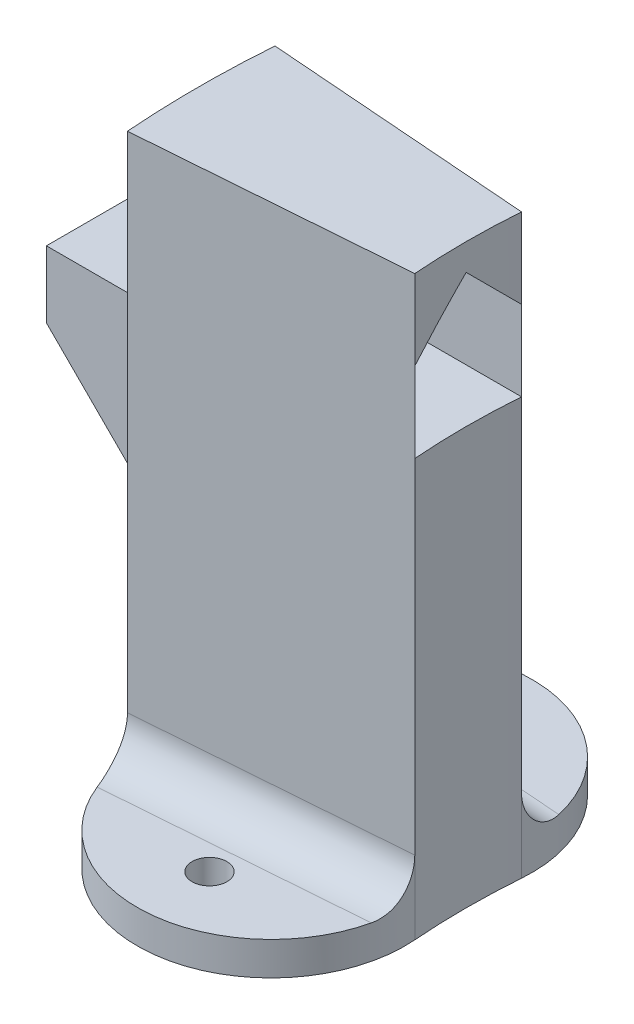
ISO-10303-21;
HEADER;
FILE_DESCRIPTION(('STEP AP214'),'2;1');
FILE_NAME('part.step','',(''),(''),'','','');
FILE_SCHEMA(('AUTOMOTIVE_DESIGN { 1 0 10303 214 1 1 1 1 }'));
ENDSEC;
DATA;
#1=APPLICATION_CONTEXT('core data for automotive mechanical design processes');
#2=APPLICATION_PROTOCOL_DEFINITION('international standard','automotive_design',2000,#1);
#3=PRODUCT_CONTEXT('',#1,'mechanical');
#4=PRODUCT('Part','Part','',(#3));
#5=PRODUCT_RELATED_PRODUCT_CATEGORY('part','',(#4));
#6=PRODUCT_DEFINITION_FORMATION('','',#4);
#7=PRODUCT_DEFINITION_CONTEXT('part definition',#1,'design');
#8=PRODUCT_DEFINITION('design','',#6,#7);
#9=PRODUCT_DEFINITION_SHAPE('','',#8);
#10=(LENGTH_UNIT() NAMED_UNIT(*) SI_UNIT(.MILLI.,.METRE.));
#11=(NAMED_UNIT(*) PLANE_ANGLE_UNIT() SI_UNIT($,.RADIAN.));
#12=(NAMED_UNIT(*) SI_UNIT($,.STERADIAN.) SOLID_ANGLE_UNIT());
#13=UNCERTAINTY_MEASURE_WITH_UNIT(LENGTH_MEASURE(1.E-05),#10,'distance_accuracy_value','');
#14=(GEOMETRIC_REPRESENTATION_CONTEXT(3) GLOBAL_UNCERTAINTY_ASSIGNED_CONTEXT((#13)) GLOBAL_UNIT_ASSIGNED_CONTEXT((#10,
#11,#12)) REPRESENTATION_CONTEXT('',''));
#15=CARTESIAN_POINT('',(0.,0.,0.));
#16=DIRECTION('',(0.,0.,1.));
#17=DIRECTION('',(1.,0.,0.));
#18=AXIS2_PLACEMENT_3D('',#15,#16,#17);
#19=CARTESIAN_POINT('',(0.,28.536162892,0.));
#20=DIRECTION('',(0.,1.,0.));
#21=DIRECTION('',(0.,0.,1.));
#22=AXIS2_PLACEMENT_3D('',#19,#20,#21);
#23=CYLINDRICAL_SURFACE('',#22,184.298091778145);
#24=DIRECTION('',(0.,1.,0.));
#25=VECTOR('',#24,1.);
#26=CARTESIAN_POINT('',(-184.017828030508,28.536162892,10.16));
#27=LINE('',#26,#25);
#28=CARTESIAN_POINT('',(-184.017828030508,47.5861628920004,10.16));
#29=VERTEX_POINT('',#28);
#30=CARTESIAN_POINT('',(-184.017828030508,79.336162892,10.16));
#31=VERTEX_POINT('',#30);
#32=EDGE_CURVE('E123',#29,#31,#27,.T.);
#33=ORIENTED_EDGE('',*,*,#32,.F.);
#34=CARTESIAN_POINT('',(0.,-136.43166513851,0.));
#35=DIRECTION('',(-0.707106781186551,-0.707106781186544,0.));
#36=DIRECTION('',(-0.707106781186544,0.707106781186551,0.));
#37=AXIS2_PLACEMENT_3D('',#34,#35,#36);
#38=ELLIPSE('',#37,260.636860912136,184.298091778145);
#39=CARTESIAN_POINT('',(-184.017828030508,47.5861628920005,-10.16));
#40=VERTEX_POINT('',#39);
#41=EDGE_CURVE('E64',#29,#40,#38,.T.);
#42=ORIENTED_EDGE('',*,*,#41,.T.);
#43=DIRECTION('',(0.,1.,0.));
#44=VECTOR('',#43,1.);
#45=CARTESIAN_POINT('',(-184.017828030508,28.536162892,-10.16));
#46=LINE('',#45,#44);
#47=CARTESIAN_POINT('',(-184.017828030508,79.336162892,-10.16));
#48=VERTEX_POINT('',#47);
#49=EDGE_CURVE('E93',#40,#48,#46,.T.);
#50=ORIENTED_EDGE('',*,*,#49,.T.);
#51=CARTESIAN_POINT('',(0.,79.336162892,0.));
#52=DIRECTION('',(0.,-1.,0.));
#53=DIRECTION('',(0.,0.,1.));
#54=AXIS2_PLACEMENT_3D('',#51,#52,#53);
#55=CIRCLE('',#54,184.298091778145);
#56=EDGE_CURVE('E96',#31,#48,#55,.T.);
#57=ORIENTED_EDGE('',*,*,#56,.F.);
#58=EDGE_LOOP('',(#33,#42,#50,#57));
#59=FACE_BOUND('',#58,.T.);
#60=ADVANCED_FACE('F55',(#59),#23,.F.);
#61=CARTESIAN_POINT('',(-184.017828030508,28.536162892,10.16));
#62=DIRECTION('',(0.,0.,1.));
#63=DIRECTION('',(1.,0.,0.));
#64=AXIS2_PLACEMENT_3D('',#61,#62,#63);
#65=PLANE('',#64);
#66=DIRECTION('',(0.,1.,0.));
#67=VECTOR('',#66,1.);
#68=CARTESIAN_POINT('',(-203.067828030508,28.536162892,10.16));
#69=LINE('',#68,#67);
#70=CARTESIAN_POINT('',(-203.067828030508,66.6361628920007,10.16));
#71=VERTEX_POINT('',#70);
#72=CARTESIAN_POINT('',(-203.067828030508,79.336162892,10.16));
#73=VERTEX_POINT('',#72);
#74=EDGE_CURVE('E126',#71,#73,#69,.T.);
#75=ORIENTED_EDGE('',*,*,#74,.F.);
#76=DIRECTION('',(0.707106781186544,-0.707106781186551,0.));
#77=VECTOR('',#76,1.);
#78=CARTESIAN_POINT('',(-174.492828030508,38.0611628920001,10.16));
#79=LINE('',#78,#77);
#80=EDGE_CURVE('E78',#71,#29,#79,.T.);
#81=ORIENTED_EDGE('',*,*,#80,.T.);
#82=ORIENTED_EDGE('',*,*,#32,.T.);
#83=DIRECTION('',(1.,0.,0.));
#84=VECTOR('',#83,1.);
#85=CARTESIAN_POINT('',(-184.017828030508,79.336162892,10.16));
#86=LINE('',#85,#84);
#87=EDGE_CURVE('E101',#73,#31,#86,.T.);
#88=ORIENTED_EDGE('',*,*,#87,.F.);
#89=EDGE_LOOP('',(#75,#81,#82,#88));
#90=FACE_BOUND('',#89,.T.);
#91=ADVANCED_FACE('F135',(#90),#65,.T.);
#92=CARTESIAN_POINT('',(-203.067828030508,28.536162892,-10.16));
#93=DIRECTION('',(-1.,0.,0.));
#94=DIRECTION('',(0.,0.,1.));
#95=AXIS2_PLACEMENT_3D('',#92,#93,#94);
#96=PLANE('',#95);
#97=DIRECTION('',(0.,1.,0.));
#98=VECTOR('',#97,1.);
#99=CARTESIAN_POINT('',(-203.067828030508,28.536162892,-10.16));
#100=LINE('',#99,#98);
#101=CARTESIAN_POINT('',(-203.067828030508,66.6361628920007,-10.16));
#102=VERTEX_POINT('',#101);
#103=CARTESIAN_POINT('',(-203.067828030508,79.336162892,-10.16));
#104=VERTEX_POINT('',#103);
#105=EDGE_CURVE('E100',#102,#104,#100,.T.);
#106=ORIENTED_EDGE('',*,*,#105,.F.);
#107=DIRECTION('',(0.,0.,1.));
#108=VECTOR('',#107,1.);
#109=CARTESIAN_POINT('',(-203.067828030508,66.6361628920007,10.16));
#110=LINE('',#109,#108);
#111=EDGE_CURVE('E125',#102,#71,#110,.T.);
#112=ORIENTED_EDGE('',*,*,#111,.T.);
#113=ORIENTED_EDGE('',*,*,#74,.T.);
#114=DIRECTION('',(0.,0.,1.));
#115=VECTOR('',#114,1.);
#116=CARTESIAN_POINT('',(-203.067828030508,79.336162892,-10.16));
#117=LINE('',#116,#115);
#118=EDGE_CURVE('E110',#104,#73,#117,.T.);
#119=ORIENTED_EDGE('',*,*,#118,.F.);
#120=EDGE_LOOP('',(#106,#112,#113,#119));
#121=FACE_BOUND('',#120,.T.);
#122=ADVANCED_FACE('F133',(#121),#96,.T.);
#123=CARTESIAN_POINT('',(-184.017828030508,28.536162892,-10.16));
#124=DIRECTION('',(0.,0.,-1.));
#125=DIRECTION('',(-1.,0.,0.));
#126=AXIS2_PLACEMENT_3D('',#123,#124,#125);
#127=PLANE('',#126);
#128=ORIENTED_EDGE('',*,*,#49,.F.);
#129=DIRECTION('',(-0.707106781186544,0.707106781186551,0.));
#130=VECTOR('',#129,1.);
#131=CARTESIAN_POINT('',(-174.492828030508,38.0611628920001,-10.16));
#132=LINE('',#131,#130);
#133=EDGE_CURVE('E12',#40,#102,#132,.T.);
#134=ORIENTED_EDGE('',*,*,#133,.T.);
#135=ORIENTED_EDGE('',*,*,#105,.T.);
#136=DIRECTION('',(-1.,0.,0.));
#137=VECTOR('',#136,1.);
#138=CARTESIAN_POINT('',(-184.017828030508,79.336162892,-10.16));
#139=LINE('',#138,#137);
#140=EDGE_CURVE('E104',#48,#104,#139,.T.);
#141=ORIENTED_EDGE('',*,*,#140,.F.);
#142=EDGE_LOOP('',(#128,#134,#135,#141));
#143=FACE_BOUND('',#142,.T.);
#144=ADVANCED_FACE('F105',(#143),#127,.T.);
#145=CARTESIAN_POINT('',(0.,79.336162892,0.));
#146=DIRECTION('',(0.,1.,0.));
#147=DIRECTION('',(0.,0.,1.));
#148=AXIS2_PLACEMENT_3D('',#145,#146,#147);
#149=PLANE('',#148);
#150=CARTESIAN_POINT('',(-192.907828030508,79.336162892,0.));
#151=DIRECTION('',(0.,1.,0.));
#152=DIRECTION('',(0.,0.,1.));
#153=AXIS2_PLACEMENT_3D('',#150,#151,#152);
#154=CIRCLE('',#153,2.99084999999999);
#155=CARTESIAN_POINT('',(-192.907828030508,79.336162892,2.99084999999999));
#156=VERTEX_POINT('',#155);
#157=EDGE_CURVE('E117',#156,#156,#154,.T.);
#158=ORIENTED_EDGE('',*,*,#157,.F.);
#159=EDGE_LOOP('',(#158));
#160=FACE_BOUND('',#159,.T.);
#161=ORIENTED_EDGE('',*,*,#56,.T.);
#162=ORIENTED_EDGE('',*,*,#140,.T.);
#163=ORIENTED_EDGE('',*,*,#118,.T.);
#164=ORIENTED_EDGE('',*,*,#87,.T.);
#165=EDGE_LOOP('',(#161,#162,#163,#164));
#166=FACE_BOUND('',#165,.T.);
#167=ADVANCED_FACE('F112',(#160,#166),#149,.T.);
#168=CARTESIAN_POINT('',(-203.067828030508,66.6361628920007,-10.16));
#169=DIRECTION('',(-0.707106781186551,-0.707106781186544,0.));
#170=DIRECTION('',(0.,0.,-1.));
#171=AXIS2_PLACEMENT_3D('',#168,#169,#170);
#172=PLANE('',#171);
#173=ORIENTED_EDGE('',*,*,#133,.F.);
#174=ORIENTED_EDGE('',*,*,#41,.F.);
#175=ORIENTED_EDGE('',*,*,#80,.F.);
#176=ORIENTED_EDGE('',*,*,#111,.F.);
#177=EDGE_LOOP('',(#173,#174,#175,#176));
#178=FACE_BOUND('',#177,.T.);
#179=ADVANCED_FACE('F58',(#178),#172,.T.);
#180=CARTESIAN_POINT('',(-192.907828030508,69.176162892,0.));
#181=DIRECTION('',(0.,1.,0.));
#182=DIRECTION('',(0.,0.,1.));
#183=AXIS2_PLACEMENT_3D('',#180,#181,#182);
#184=CYLINDRICAL_SURFACE('',#183,2.99084999999999);
#185=CARTESIAN_POINT('',(-192.907828030508,69.176162892,0.));
#186=DIRECTION('',(0.,1.,0.));
#187=DIRECTION('',(0.,0.,1.));
#188=AXIS2_PLACEMENT_3D('',#185,#186,#187);
#189=CIRCLE('',#188,2.99084999999999);
#190=CARTESIAN_POINT('',(-192.907828030508,69.176162892,2.99084999999999));
#191=VERTEX_POINT('',#190);
#192=EDGE_CURVE('E114',#191,#191,#189,.T.);
#193=ORIENTED_EDGE('',*,*,#192,.F.);
#194=EDGE_LOOP('',(#193));
#195=FACE_BOUND('',#194,.T.);
#196=ORIENTED_EDGE('',*,*,#157,.T.);
#197=EDGE_LOOP('',(#196));
#198=FACE_BOUND('',#197,.T.);
#199=ADVANCED_FACE('F137',(#195,#198),#184,.F.);
#200=CARTESIAN_POINT('',(-192.907828030508,69.176162892,0.));
#201=DIRECTION('',(0.,1.,0.));
#202=DIRECTION('',(0.,0.,1.));
#203=AXIS2_PLACEMENT_3D('',#200,#201,#202);
#204=PLANE('',#203);
#205=ORIENTED_EDGE('',*,*,#192,.T.);
#206=EDGE_LOOP('',(#205));
#207=FACE_BOUND('',#206,.T.);
#208=ADVANCED_FACE('F143',(#207),#204,.T.);
#209=CLOSED_SHELL('',(#60,#91,#122,#144,#167,#179,#199,#208));
#210=MANIFOLD_SOLID_BREP('B2',#209);
#211=CARTESIAN_POINT('',(0.,79.336162892,0.));
#212=DIRECTION('',(0.,1.,0.));
#213=DIRECTION('',(0.,0.,1.));
#214=AXIS2_PLACEMENT_3D('',#211,#212,#213);
#215=PLANE('',#214);
#216=CARTESIAN_POINT('',(0.,79.336162892,0.));
#217=DIRECTION('',(0.,1.,0.));
#218=DIRECTION('',(0.,0.,1.));
#219=AXIS2_PLACEMENT_3D('',#216,#217,#218);
#220=CIRCLE('',#219,133.35);
#221=CARTESIAN_POINT('',(-132.962389042917,79.336162892,-10.16));
#222=VERTEX_POINT('',#221);
#223=CARTESIAN_POINT('',(-132.962389042917,79.336162892,10.16));
#224=VERTEX_POINT('',#223);
#225=EDGE_CURVE('E384',#222,#224,#220,.T.);
#226=ORIENTED_EDGE('',*,*,#225,.F.);
#227=DIRECTION('',(1.,0.,0.));
#228=VECTOR('',#227,1.);
#229=CARTESIAN_POINT('',(-132.962389042917,79.336162892,-10.16));
#230=LINE('',#229,#228);
#231=CARTESIAN_POINT('',(-184.017828030508,79.336162892,-10.16));
#232=VERTEX_POINT('',#231);
#233=EDGE_CURVE('E336',#232,#222,#230,.T.);
#234=ORIENTED_EDGE('',*,*,#233,.F.);
#235=CARTESIAN_POINT('',(0.,79.336162892,0.));
#236=DIRECTION('',(0.,1.,0.));
#237=DIRECTION('',(0.,0.,1.));
#238=AXIS2_PLACEMENT_3D('',#235,#236,#237);
#239=CIRCLE('',#238,184.298091778145);
#240=CARTESIAN_POINT('',(-184.017828030508,79.336162892,10.16));
#241=VERTEX_POINT('',#240);
#242=EDGE_CURVE('E381',#232,#241,#239,.T.);
#243=ORIENTED_EDGE('',*,*,#242,.T.);
#244=DIRECTION('',(-1.,0.,0.));
#245=VECTOR('',#244,1.);
#246=CARTESIAN_POINT('',(-132.962389042917,79.336162892,10.16));
#247=LINE('',#246,#245);
#248=EDGE_CURVE('E339',#224,#241,#247,.T.);
#249=ORIENTED_EDGE('',*,*,#248,.F.);
#250=EDGE_LOOP('',(#226,#234,#243,#249));
#251=FACE_BOUND('',#250,.T.);
#252=ADVANCED_FACE('F212',(#251),#215,.T.);
#253=CARTESIAN_POINT('',(0.,79.336162892,0.));
#254=DIRECTION('',(0.0761904761904762,0.,-0.997093281161732));
#255=DIRECTION('',(-0.997093281161732,0.,-0.0761904761904762));
#256=AXIS2_PLACEMENT_3D('',#253,#254,#255);
#257=PLANE('',#256);
#258=DIRECTION('',(0.,-1.,0.));
#259=VECTOR('',#258,1.);
#260=CARTESIAN_POINT('',(-132.962389042917,79.336162892,-10.16));
#261=LINE('',#260,#259);
#262=CARTESIAN_POINT('',(-132.962389042917,13.97,-10.16));
#263=VERTEX_POINT('',#262);
#264=EDGE_CURVE('E388',#222,#263,#261,.T.);
#265=ORIENTED_EDGE('',*,*,#264,.T.);
#266=DIRECTION('',(0.997093281161732,0.,0.0761904761904762));
#267=VECTOR('',#266,1.);
#268=CARTESIAN_POINT('',(-183.762389042917,13.97,-14.041759373573));
#269=LINE('',#268,#267);
#270=CARTESIAN_POINT('',(-183.762389042917,13.97,-14.041759373573));
#271=VERTEX_POINT('',#270);
#272=EDGE_CURVE('E402',#263,#271,#269,.F.);
#273=ORIENTED_EDGE('',*,*,#272,.T.);
#274=DIRECTION('',(0.,-1.,0.));
#275=VECTOR('',#274,1.);
#276=CARTESIAN_POINT('',(-183.762389042917,79.336162892,-14.041759373573));
#277=LINE('',#276,#275);
#278=CARTESIAN_POINT('',(-183.762389042917,109.816162892,-14.041759373573));
#279=VERTEX_POINT('',#278);
#280=EDGE_CURVE('E307',#279,#271,#277,.T.);
#281=ORIENTED_EDGE('',*,*,#280,.F.);
#282=DIRECTION('',(-0.997093281161732,0.,-0.0761904761904762));
#283=VECTOR('',#282,1.);
#284=CARTESIAN_POINT('',(-132.962389042917,109.816162892,-10.16));
#285=LINE('',#284,#283);
#286=CARTESIAN_POINT('',(-132.962389042917,109.816162892,-10.16));
#287=VERTEX_POINT('',#286);
#288=EDGE_CURVE('E301',#287,#279,#285,.T.);
#289=ORIENTED_EDGE('',*,*,#288,.F.);
#290=DIRECTION('',(0.,-1.,0.));
#291=VECTOR('',#290,1.);
#292=CARTESIAN_POINT('',(-132.962389042917,109.816162892,-10.16));
#293=LINE('',#292,#291);
#294=CARTESIAN_POINT('',(-132.962389042917,94.576162892,-10.16));
#295=VERTEX_POINT('',#294);
#296=EDGE_CURVE('E230',#287,#295,#293,.T.);
#297=ORIENTED_EDGE('',*,*,#296,.T.);
#298=DIRECTION('',(0.,-1.,0.));
#299=VECTOR('',#298,1.);
#300=CARTESIAN_POINT('',(-132.962389042917,107.276162892,-10.16));
#301=LINE('',#300,#299);
#302=EDGE_CURVE('E330',#295,#222,#301,.T.);
#303=ORIENTED_EDGE('',*,*,#302,.T.);
#304=EDGE_LOOP('',(#265,#273,#281,#289,#297,#303));
#305=FACE_BOUND('',#304,.T.);
#306=ADVANCED_FACE('F304',(#305),#257,.T.);
#307=CARTESIAN_POINT('',(0.,79.336162892,0.));
#308=DIRECTION('',(0.,-1.,0.));
#309=DIRECTION('',(0.,0.,-1.));
#310=AXIS2_PLACEMENT_3D('',#307,#308,#309);
#311=CYLINDRICAL_SURFACE('',#310,184.298091778145);
#312=DIRECTION('',(0.,-1.,0.));
#313=VECTOR('',#312,1.);
#314=CARTESIAN_POINT('',(-183.762389042917,79.336162892,14.041759373573));
#315=LINE('',#314,#313);
#316=CARTESIAN_POINT('',(-183.762389042917,109.816162892,14.0417593735729));
#317=VERTEX_POINT('',#316);
#318=CARTESIAN_POINT('',(-183.762389042917,13.97,14.041759373573));
#319=VERTEX_POINT('',#318);
#320=EDGE_CURVE('E395',#317,#319,#315,.T.);
#321=ORIENTED_EDGE('',*,*,#320,.F.);
#322=CARTESIAN_POINT('',(0.,109.816162892,0.));
#323=DIRECTION('',(0.,1.,0.));
#324=DIRECTION('',(0.,0.,1.));
#325=AXIS2_PLACEMENT_3D('',#322,#323,#324);
#326=CIRCLE('',#325,184.298091778145);
#327=EDGE_CURVE('E311',#279,#317,#326,.T.);
#328=ORIENTED_EDGE('',*,*,#327,.F.);
#329=ORIENTED_EDGE('',*,*,#280,.T.);
#330=DIRECTION('',(0.,-1.,0.));
#331=VECTOR('',#330,1.);
#332=CARTESIAN_POINT('',(-183.762389042917,6.35,-14.041759373573));
#333=LINE('',#332,#331);
#334=CARTESIAN_POINT('',(-183.762389042917,0.,-14.041759373573));
#335=VERTEX_POINT('',#334);
#336=EDGE_CURVE('E354',#271,#335,#333,.T.);
#337=ORIENTED_EDGE('',*,*,#336,.T.);
#338=CARTESIAN_POINT('',(0.,0.,0.));
#339=DIRECTION('',(0.,1.,0.));
#340=DIRECTION('',(0.,0.,1.));
#341=AXIS2_PLACEMENT_3D('',#338,#339,#340);
#342=CIRCLE('',#341,184.298091778145);
#343=CARTESIAN_POINT('',(-183.762389042917,0.,14.041759373573));
#344=VERTEX_POINT('',#343);
#345=EDGE_CURVE('E380',#335,#344,#342,.T.);
#346=ORIENTED_EDGE('',*,*,#345,.T.);
#347=DIRECTION('',(0.,-1.,0.));
#348=VECTOR('',#347,1.);
#349=CARTESIAN_POINT('',(-183.762389042917,6.35,14.041759373573));
#350=LINE('',#349,#348);
#351=EDGE_CURVE('E377',#319,#344,#350,.T.);
#352=ORIENTED_EDGE('',*,*,#351,.F.);
#353=EDGE_LOOP('',(#321,#328,#329,#337,#346,#352));
#354=FACE_BOUND('',#353,.T.);
#355=CARTESIAN_POINT('',(0.,104.736162892,0.));
#356=DIRECTION('',(0.,-0.707106781186551,0.707106781186544));
#357=DIRECTION('',(0.,-0.707106781186544,-0.707106781186551));
#358=AXIS2_PLACEMENT_3D('',#355,#356,#357);
#359=ELLIPSE('',#358,260.636860912133,184.298091778145);
#360=CARTESIAN_POINT('',(-184.017828030508,94.576162892,-10.16));
#361=VERTEX_POINT('',#360);
#362=CARTESIAN_POINT('',(-184.298091778145,104.736162892,0.));
#363=VERTEX_POINT('',#362);
#364=EDGE_CURVE('E495',#361,#363,#359,.F.);
#365=ORIENTED_EDGE('',*,*,#364,.T.);
#366=CARTESIAN_POINT('',(0.,104.736162892,0.));
#367=DIRECTION('',(0.,-0.707106781186551,-0.707106781186544));
#368=DIRECTION('',(0.,-0.707106781186544,0.707106781186551));
#369=AXIS2_PLACEMENT_3D('',#366,#367,#368);
#370=ELLIPSE('',#369,260.636860912133,184.298091778145);
#371=CARTESIAN_POINT('',(-184.017828030508,94.5761628920001,10.16));
#372=VERTEX_POINT('',#371);
#373=EDGE_CURVE('E223',#363,#372,#370,.F.);
#374=ORIENTED_EDGE('',*,*,#373,.T.);
#375=DIRECTION('',(0.,-1.,0.));
#376=VECTOR('',#375,1.);
#377=CARTESIAN_POINT('',(-184.017828030508,107.276162892,10.16));
#378=LINE('',#377,#376);
#379=EDGE_CURVE('E342',#372,#241,#378,.T.);
#380=ORIENTED_EDGE('',*,*,#379,.T.);
#381=ORIENTED_EDGE('',*,*,#242,.F.);
#382=DIRECTION('',(0.,-1.,0.));
#383=VECTOR('',#382,1.);
#384=CARTESIAN_POINT('',(-184.017828030508,107.276162892,-10.16));
#385=LINE('',#384,#383);
#386=EDGE_CURVE('E327',#361,#232,#385,.T.);
#387=ORIENTED_EDGE('',*,*,#386,.F.);
#388=EDGE_LOOP('',(#365,#374,#380,#381,#387));
#389=FACE_BOUND('',#388,.T.);
#390=ADVANCED_FACE('F486',(#354,#389),#311,.T.);
#391=CARTESIAN_POINT('',(0.,79.336162892,0.));
#392=DIRECTION('',(-0.0761904761904762,0.,-0.997093281161732));
#393=DIRECTION('',(-0.997093281161732,0.,0.0761904761904762));
#394=AXIS2_PLACEMENT_3D('',#391,#392,#393);
#395=PLANE('',#394);
#396=ORIENTED_EDGE('',*,*,#320,.T.);
#397=DIRECTION('',(0.997093281161732,0.,-0.0761904761904762));
#398=VECTOR('',#397,1.);
#399=CARTESIAN_POINT('',(0.,13.97,0.));
#400=LINE('',#399,#398);
#401=CARTESIAN_POINT('',(-132.962389042917,13.97,10.16));
#402=VERTEX_POINT('',#401);
#403=EDGE_CURVE('E404',#319,#402,#400,.T.);
#404=ORIENTED_EDGE('',*,*,#403,.T.);
#405=DIRECTION('',(0.,-1.,0.));
#406=VECTOR('',#405,1.);
#407=CARTESIAN_POINT('',(-132.962389042917,79.336162892,10.16));
#408=LINE('',#407,#406);
#409=EDGE_CURVE('E392',#224,#402,#408,.T.);
#410=ORIENTED_EDGE('',*,*,#409,.F.);
#411=DIRECTION('',(0.,-1.,0.));
#412=VECTOR('',#411,1.);
#413=CARTESIAN_POINT('',(-132.962389042917,107.276162892,10.16));
#414=LINE('',#413,#412);
#415=CARTESIAN_POINT('',(-132.962389042917,94.5761628920001,10.16));
#416=VERTEX_POINT('',#415);
#417=EDGE_CURVE('E344',#416,#224,#414,.T.);
#418=ORIENTED_EDGE('',*,*,#417,.F.);
#419=DIRECTION('',(0.,-1.,0.));
#420=VECTOR('',#419,1.);
#421=CARTESIAN_POINT('',(-132.962389042917,109.816162892,10.16));
#422=LINE('',#421,#420);
#423=CARTESIAN_POINT('',(-132.962389042917,109.816162892,10.16));
#424=VERTEX_POINT('',#423);
#425=EDGE_CURVE('E328',#424,#416,#422,.T.);
#426=ORIENTED_EDGE('',*,*,#425,.F.);
#427=DIRECTION('',(0.997093281161732,0.,-0.0761904761904762));
#428=VECTOR('',#427,1.);
#429=CARTESIAN_POINT('',(-183.762389042917,109.816162892,14.041759373573));
#430=LINE('',#429,#428);
#431=EDGE_CURVE('E317',#317,#424,#430,.T.);
#432=ORIENTED_EDGE('',*,*,#431,.F.);
#433=EDGE_LOOP('',(#396,#404,#410,#418,#426,#432));
#434=FACE_BOUND('',#433,.T.);
#435=ADVANCED_FACE('F483',(#434),#395,.F.);
#436=CARTESIAN_POINT('',(0.,79.336162892,0.));
#437=DIRECTION('',(0.,-1.,0.));
#438=DIRECTION('',(0.,0.,-1.));
#439=AXIS2_PLACEMENT_3D('',#436,#437,#438);
#440=CYLINDRICAL_SURFACE('',#439,133.35);
#441=CARTESIAN_POINT('',(0.,0.,0.));
#442=DIRECTION('',(0.,1.,0.));
#443=DIRECTION('',(0.,0.,1.));
#444=AXIS2_PLACEMENT_3D('',#441,#442,#443);
#445=CIRCLE('',#444,133.35);
#446=CARTESIAN_POINT('',(-132.962389042917,0.,-10.16));
#447=VERTEX_POINT('',#446);
#448=CARTESIAN_POINT('',(-132.962389042917,0.,10.16));
#449=VERTEX_POINT('',#448);
#450=EDGE_CURVE('E385',#447,#449,#445,.T.);
#451=ORIENTED_EDGE('',*,*,#450,.F.);
#452=DIRECTION('',(0.,-1.,0.));
#453=VECTOR('',#452,1.);
#454=CARTESIAN_POINT('',(-132.962389042917,6.35,-10.16));
#455=LINE('',#454,#453);
#456=EDGE_CURVE('E360',#263,#447,#455,.T.);
#457=ORIENTED_EDGE('',*,*,#456,.F.);
#458=ORIENTED_EDGE('',*,*,#264,.F.);
#459=ORIENTED_EDGE('',*,*,#225,.T.);
#460=ORIENTED_EDGE('',*,*,#409,.T.);
#461=DIRECTION('',(0.,-1.,0.));
#462=VECTOR('',#461,1.);
#463=CARTESIAN_POINT('',(-132.962389042917,6.35,10.16));
#464=LINE('',#463,#462);
#465=EDGE_CURVE('E370',#402,#449,#464,.T.);
#466=ORIENTED_EDGE('',*,*,#465,.T.);
#467=EDGE_LOOP('',(#451,#457,#458,#459,#460,#466));
#468=FACE_BOUND('',#467,.T.);
#469=ADVANCED_FACE('F479',(#468),#440,.F.);
#470=CARTESIAN_POINT('',(0.,0.,0.));
#471=DIRECTION('',(0.,1.,0.));
#472=DIRECTION('',(0.,0.,1.));
#473=AXIS2_PLACEMENT_3D('',#470,#471,#472);
#474=PLANE('',#473);
#475=ORIENTED_EDGE('',*,*,#345,.F.);
#476=CARTESIAN_POINT('',(-158.362389042917,0.,-12.1008796867865));
#477=DIRECTION('',(0.,1.,0.));
#478=DIRECTION('',(0.,0.,1.));
#479=AXIS2_PLACEMENT_3D('',#476,#477,#478);
#480=CIRCLE('',#479,25.4740458890727);
#481=EDGE_CURVE('E351',#447,#335,#480,.T.);
#482=ORIENTED_EDGE('',*,*,#481,.F.);
#483=ORIENTED_EDGE('',*,*,#450,.T.);
#484=CARTESIAN_POINT('',(-158.362389042917,0.,12.1008796867865));
#485=DIRECTION('',(0.,1.,0.));
#486=DIRECTION('',(0.,0.,1.));
#487=AXIS2_PLACEMENT_3D('',#484,#485,#486);
#488=CIRCLE('',#487,25.4740458890727);
#489=EDGE_CURVE('E367',#344,#449,#488,.T.);
#490=ORIENTED_EDGE('',*,*,#489,.F.);
#491=EDGE_LOOP('',(#475,#482,#483,#490));
#492=FACE_BOUND('',#491,.T.);
#493=CARTESIAN_POINT('',(-157.391949199524,0.,24.8008796867865));
#494=DIRECTION('',(0.,1.,0.));
#495=DIRECTION('',(0.,0.,1.));
#496=AXIS2_PLACEMENT_3D('',#493,#494,#495);
#497=CIRCLE('',#496,3.32499999999999);
#498=CARTESIAN_POINT('',(-157.391949199524,0.,28.1258796867865));
#499=VERTEX_POINT('',#498);
#500=EDGE_CURVE('E362',#499,#499,#497,.T.);
#501=ORIENTED_EDGE('',*,*,#500,.T.);
#502=EDGE_LOOP('',(#501));
#503=FACE_BOUND('',#502,.T.);
#504=CARTESIAN_POINT('',(-157.391949199524,0.,-24.8008796867865));
#505=DIRECTION('',(0.,1.,0.));
#506=DIRECTION('',(0.,0.,1.));
#507=AXIS2_PLACEMENT_3D('',#504,#505,#506);
#508=CIRCLE('',#507,3.32499999999999);
#509=CARTESIAN_POINT('',(-157.391949199524,0.,-21.4758796867865));
#510=VERTEX_POINT('',#509);
#511=EDGE_CURVE('E346',#510,#510,#508,.T.);
#512=ORIENTED_EDGE('',*,*,#511,.T.);
#513=EDGE_LOOP('',(#512));
#514=FACE_BOUND('',#513,.T.);
#515=ADVANCED_FACE('F472',(#492,#503,#514),#474,.F.);
#516=CARTESIAN_POINT('',(-157.391949199524,6.35,24.8008796867865));
#517=DIRECTION('',(0.,-1.,0.));
#518=DIRECTION('',(0.,0.,-1.));
#519=AXIS2_PLACEMENT_3D('',#516,#517,#518);
#520=CYLINDRICAL_SURFACE('',#519,3.32499999999999);
#521=CARTESIAN_POINT('',(-157.391949199524,6.35,24.8008796867865));
#522=DIRECTION('',(0.,1.,0.));
#523=DIRECTION('',(0.,0.,1.));
#524=AXIS2_PLACEMENT_3D('',#521,#522,#523);
#525=CIRCLE('',#524,3.32499999999999);
#526=CARTESIAN_POINT('',(-157.391949199524,6.35,28.1258796867865));
#527=VERTEX_POINT('',#526);
#528=EDGE_CURVE('E363',#527,#527,#525,.T.);
#529=ORIENTED_EDGE('',*,*,#528,.T.);
#530=EDGE_LOOP('',(#529));
#531=FACE_BOUND('',#530,.T.);
#532=ORIENTED_EDGE('',*,*,#500,.F.);
#533=EDGE_LOOP('',(#532));
#534=FACE_BOUND('',#533,.T.);
#535=ADVANCED_FACE('F467',(#531,#534),#520,.F.);
#536=CARTESIAN_POINT('',(-158.362389042917,6.35,12.1008796867865));
#537=DIRECTION('',(0.,-1.,0.));
#538=DIRECTION('',(0.,0.,-1.));
#539=AXIS2_PLACEMENT_3D('',#536,#537,#538);
#540=CYLINDRICAL_SURFACE('',#539,25.4740458890727);
#541=ORIENTED_EDGE('',*,*,#489,.T.);
#542=ORIENTED_EDGE('',*,*,#465,.F.);
#543=CARTESIAN_POINT('',(-132.962389042917,13.97,10.16));
#544=CARTESIAN_POINT('',(-132.962411039116,13.7558693433996,10.159978649774));
#545=CARTESIAN_POINT('',(-132.961702059079,13.5417419702134,10.1689988250808));
#546=CARTESIAN_POINT('',(-132.958981105079,13.1150157717762,10.2049680908419));
#547=CARTESIAN_POINT('',(-132.956969188712,12.9024168793791,10.2319163887917));
#548=CARTESIAN_POINT('',(-132.951802841156,12.480376777311,10.3035663385194));
#549=CARTESIAN_POINT('',(-132.948649094578,12.2709337536777,10.3482573537765));
#550=CARTESIAN_POINT('',(-132.941506456313,11.8565637502954,10.4550895112339));
#551=CARTESIAN_POINT('',(-132.937517574879,11.6516367151359,10.5172304391976));
#552=CARTESIAN_POINT('',(-132.929107361247,11.2476452763914,10.6585887455456));
#553=CARTESIAN_POINT('',(-132.924685799965,11.0485840518347,10.7378151969143));
#554=CARTESIAN_POINT('',(-132.915913121206,10.6578560063875,10.9127941257492));
#555=CARTESIAN_POINT('',(-132.911562004874,10.4661893057644,11.0085468718668));
#556=CARTESIAN_POINT('',(-132.903508463486,10.0916588160135,11.2159097580957));
#557=CARTESIAN_POINT('',(-132.899805935687,9.90879363597232,11.3275173815555));
#558=CARTESIAN_POINT('',(-132.893684063928,9.55315567007875,11.5658270294909));
#559=CARTESIAN_POINT('',(-132.891264707682,9.38038278761045,11.6925289094303));
#560=CARTESIAN_POINT('',(-132.888386062382,9.04680350909757,11.9596315995628));
#561=CARTESIAN_POINT('',(-132.887919543076,8.88595514109972,12.099979905324));
#562=CARTESIAN_POINT('',(-132.889603355913,8.57668857125107,12.3937465344285));
#563=CARTESIAN_POINT('',(-132.891753646526,8.42827017217641,12.5471646503178));
#564=CARTESIAN_POINT('',(-132.899334336773,8.1449525056087,12.8659032626741));
#565=CARTESIAN_POINT('',(-132.904764288106,8.01005139336696,13.0312221297002));
#566=CARTESIAN_POINT('',(-132.919528555052,7.75470661922785,13.3725040683048));
#567=CARTESIAN_POINT('',(-132.928862769642,7.63426258336128,13.5484668643737));
#568=CARTESIAN_POINT('',(-132.951819042473,7.41037233494514,13.9068963185552));
#569=CARTESIAN_POINT('',(-132.965373601346,7.30669509423827,14.0892230288502));
#570=CARTESIAN_POINT('',(-132.997261257867,7.1147950913107,14.4614294082034));
#571=CARTESIAN_POINT('',(-133.015594297293,7.02657214081225,14.6513089852112));
#572=CARTESIAN_POINT('',(-133.057391922093,6.86604685083718,15.0371649378856));
#573=CARTESIAN_POINT('',(-133.080856987495,6.79374600191792,15.2331418824025));
#574=CARTESIAN_POINT('',(-133.133132258179,6.66539114541395,15.6295683661411));
#575=CARTESIAN_POINT('',(-133.161941530839,6.6093343074423,15.8300171196231));
#576=CARTESIAN_POINT('',(-133.240244155429,6.49052405876575,16.3312800284996));
#577=CARTESIAN_POINT('',(-133.293020054473,6.43752670398556,16.6339787599002));
#578=CARTESIAN_POINT('',(-133.380981768279,6.3848388200989,17.0888900660618));
#579=CARTESIAN_POINT('',(-133.411744888806,6.37174403219144,17.2405682105368));
#580=CARTESIAN_POINT('',(-133.476141261806,6.35432567781629,17.5438306292275));
#581=CARTESIAN_POINT('',(-133.509774701124,6.35000268280909,17.6954148966843));
#582=CARTESIAN_POINT('',(-133.544807419528,6.35,17.8467178610673));
#583=B_SPLINE_CURVE_WITH_KNOTS('',3,(#543,#544,#545,#546,#547,#548,#549,#550,#551,#552,#553,
#554,#555,#556,#557,#558,#559,#560,#561,#562,#563,#564,#565,#566,#567,#568,#569,#570,#571,#572,
#573,#574,#575,#576,#577,#578,#579,#580,#581,#582),.UNSPECIFIED.,.F.,.F.,(4,2,2,2,2,2,2,2,2,2,2,
2,2,2,2,2,2,2,2,4),(0.,0.642196266837894,1.28436414756263,1.92614763716852,2.56792324779492,
3.21004050564859,3.85216820274114,4.49419408828083,5.13621382654783,5.7758544143381,
6.4154848511548,7.05502787626522,7.69455435439479,8.32433659052735,8.95411115356481,
9.5839446482977,10.2136683335817,11.1463923071962,11.6121250454155,12.0778881239909),.UNSPECIFIED.);
#584=CARTESIAN_POINT('',(-133.544807419528,6.35,17.8467178610673));
#585=VERTEX_POINT('',#584);
#586=EDGE_CURVE('E445',#402,#585,#583,.T.);
#587=ORIENTED_EDGE('',*,*,#586,.T.);
#588=CARTESIAN_POINT('',(-158.362389042917,6.35,12.1008796867865));
#589=DIRECTION('',(0.,1.,0.));
#590=DIRECTION('',(0.,0.,1.));
#591=AXIS2_PLACEMENT_3D('',#588,#589,#590);
#592=CIRCLE('',#591,25.4740458890727);
#593=CARTESIAN_POINT('',(-182.018827809163,6.35,21.5507431174105));
#594=VERTEX_POINT('',#593);
#595=EDGE_CURVE('E366',#594,#585,#592,.T.);
#596=ORIENTED_EDGE('',*,*,#595,.F.);
#597=CARTESIAN_POINT('',(-182.018827809163,6.35,21.5507431174105));
#598=CARTESIAN_POINT('',(-182.098021632823,6.34997557158433,21.3525589117556));
#599=CARTESIAN_POINT('',(-182.174689239072,6.35816310395469,21.1533375693788));
#600=CARTESIAN_POINT('',(-182.322601205103,6.3911887295775,20.7542151684385));
#601=CARTESIAN_POINT('',(-182.393844332228,6.4160305948618,20.5543139661009));
#602=CARTESIAN_POINT('',(-182.530495207598,6.48258926335009,20.1553323547596));
#603=CARTESIAN_POINT('',(-182.59590338963,6.52430481083958,19.9562518857915));
#604=CARTESIAN_POINT('',(-182.720641674708,6.62462885268723,19.5604752561849));
#605=CARTESIAN_POINT('',(-182.77997238175,6.68323566613695,19.3637788603276));
#606=CARTESIAN_POINT('',(-182.892549635339,6.81732542147715,18.9739778272421));
#607=CARTESIAN_POINT('',(-182.945784236088,6.89284066948975,18.7808808426322));
#608=CARTESIAN_POINT('',(-183.046048888004,7.06034259370127,18.4002985370274));
#609=CARTESIAN_POINT('',(-183.093078921702,7.15232931627724,18.2128132318344));
#610=CARTESIAN_POINT('',(-183.181047232171,7.35218501130705,17.8451749634198));
#611=CARTESIAN_POINT('',(-183.221989315405,7.46004397505703,17.6650174701504));
#612=CARTESIAN_POINT('',(-183.298074782255,7.69098680906221,17.3134550774606));
#613=CARTESIAN_POINT('',(-183.333218320321,7.81407027364356,17.1420499449957));
#614=CARTESIAN_POINT('',(-183.39732527287,8.07162916433456,16.8132465525208));
#615=CARTESIAN_POINT('',(-183.426411605542,8.20577982748407,16.6556176603249));
#616=CARTESIAN_POINT('',(-183.4798088788,8.48693223440041,16.3513046673792));
#617=CARTESIAN_POINT('',(-183.504118294972,8.63393805896164,16.2046240696899));
#618=CARTESIAN_POINT('',(-183.548411916197,8.93977175499732,15.9233842202846));
#619=CARTESIAN_POINT('',(-183.568395328146,9.0986017870966,15.7888271938734));
#620=CARTESIAN_POINT('',(-183.604516770547,9.42695807907961,15.5328921839944));
#621=CARTESIAN_POINT('',(-183.620654738989,9.59648451139829,15.411514413073));
#622=CARTESIAN_POINT('',(-183.649706070083,9.94664476922201,15.1818116087317));
#623=CARTESIAN_POINT('',(-183.662588796642,10.1273655327008,15.0736152147763));
#624=CARTESIAN_POINT('',(-183.685418672021,10.4971741163368,14.8724198042725));
#625=CARTESIAN_POINT('',(-183.695366758562,10.6862592415336,14.7794159374323));
#626=CARTESIAN_POINT('',(-183.712780417014,11.0715252335438,14.6092648298205));
#627=CARTESIAN_POINT('',(-183.720246319719,11.2677051509857,14.5321154766821));
#628=CARTESIAN_POINT('',(-183.73308596673,11.6657401931752,14.3942438333712));
#629=CARTESIAN_POINT('',(-183.738460058629,11.8675943690558,14.3335188144986));
#630=CARTESIAN_POINT('',(-183.749778435205,12.3814823536608,14.2018300866042));
#631=CARTESIAN_POINT('',(-183.754577772774,12.6964603583379,14.1418388947051));
#632=CARTESIAN_POINT('',(-183.759302815288,13.17230657666,14.081818500509));
#633=CARTESIAN_POINT('',(-183.76046552317,13.3314387859326,14.0668061147888));
#634=CARTESIAN_POINT('',(-183.762006318574,13.6503625992855,14.0467769902116));
#635=CARTESIAN_POINT('',(-183.76238427017,13.8101543127954,14.041761982986));
#636=CARTESIAN_POINT('',(-183.762389042917,13.97,14.041759373573));
#637=B_SPLINE_CURVE_WITH_KNOTS('',3,(#597,#598,#599,#600,#601,#602,#603,#604,#605,#606,#607,
#608,#609,#610,#611,#612,#613,#614,#615,#616,#617,#618,#619,#620,#621,#622,#623,#624,#625,#626,
#627,#628,#629,#630,#631,#632,#633,#634,#635,#636),.UNSPECIFIED.,.F.,.F.,(4,2,2,2,2,2,2,2,2,2,2,
2,2,2,2,2,2,2,2,4),(0.,0.64012757541276,1.28040018201388,1.92062514923716,2.56078642743957,
3.20218142903039,3.84357823655997,4.48457231213222,5.12554931137891,5.75187275495703,
6.37839574799146,7.00503350724408,7.63168137100571,8.26402385673036,8.89616406767488,
9.52822000111493,10.1601708616926,11.1192583684813,11.59852565129,12.0778759400751),.UNSPECIFIED.);
#638=EDGE_CURVE('E452',#594,#319,#637,.T.);
#639=ORIENTED_EDGE('',*,*,#638,.T.);
#640=ORIENTED_EDGE('',*,*,#351,.T.);
#641=EDGE_LOOP('',(#541,#542,#587,#596,#639,#640));
#642=FACE_BOUND('',#641,.T.);
#643=ADVANCED_FACE('F461',(#642),#540,.T.);
#644=CARTESIAN_POINT('',(0.,6.35,0.));
#645=DIRECTION('',(0.,1.,0.));
#646=DIRECTION('',(0.,0.,1.));
#647=AXIS2_PLACEMENT_3D('',#644,#645,#646);
#648=PLANE('',#647);
#649=ORIENTED_EDGE('',*,*,#528,.F.);
#650=EDGE_LOOP('',(#649));
#651=FACE_BOUND('',#650,.T.);
#652=ORIENTED_EDGE('',*,*,#595,.T.);
#653=DIRECTION('',(0.997093281161732,0.,-0.0761904761904762));
#654=VECTOR('',#653,1.);
#655=CARTESIAN_POINT('',(0.580571428571429,6.35,7.5978508024524));
#656=LINE('',#655,#654);
#657=EDGE_CURVE('E407',#585,#594,#656,.F.);
#658=ORIENTED_EDGE('',*,*,#657,.T.);
#659=EDGE_LOOP('',(#652,#658));
#660=FACE_BOUND('',#659,.T.);
#661=ADVANCED_FACE('F466',(#651,#660),#648,.T.);
#662=CARTESIAN_POINT('',(-157.391949199524,6.35,-24.8008796867865));
#663=DIRECTION('',(0.,-1.,0.));
#664=DIRECTION('',(0.,0.,-1.));
#665=AXIS2_PLACEMENT_3D('',#662,#663,#664);
#666=CYLINDRICAL_SURFACE('',#665,3.32499999999999);
#667=CARTESIAN_POINT('',(-157.391949199524,6.35,-24.8008796867865));
#668=DIRECTION('',(0.,1.,0.));
#669=DIRECTION('',(0.,0.,1.));
#670=AXIS2_PLACEMENT_3D('',#667,#668,#669);
#671=CIRCLE('',#670,3.32499999999999);
#672=CARTESIAN_POINT('',(-157.391949199524,6.35,-21.4758796867865));
#673=VERTEX_POINT('',#672);
#674=EDGE_CURVE('E347',#673,#673,#671,.T.);
#675=ORIENTED_EDGE('',*,*,#674,.T.);
#676=EDGE_LOOP('',(#675));
#677=FACE_BOUND('',#676,.T.);
#678=ORIENTED_EDGE('',*,*,#511,.F.);
#679=EDGE_LOOP('',(#678));
#680=FACE_BOUND('',#679,.T.);
#681=ADVANCED_FACE('F549',(#677,#680),#666,.F.);
#682=CARTESIAN_POINT('',(-158.362389042917,6.35,-12.1008796867865));
#683=DIRECTION('',(0.,-1.,0.));
#684=DIRECTION('',(0.,0.,-1.));
#685=AXIS2_PLACEMENT_3D('',#682,#683,#684);
#686=CYLINDRICAL_SURFACE('',#685,25.4740458890727);
#687=ORIENTED_EDGE('',*,*,#481,.T.);
#688=ORIENTED_EDGE('',*,*,#336,.F.);
#689=CARTESIAN_POINT('',(-183.762389042917,13.97,-14.041759373573));
#690=CARTESIAN_POINT('',(-183.762370546004,13.7558693433996,-14.0417349291636));
#691=CARTESIAN_POINT('',(-183.761700787189,13.5417419702134,-14.0507581014653));
#692=CARTESIAN_POINT('',(-183.758925051817,13.1150157717762,-14.0867231812403));
#693=CARTESIAN_POINT('',(-183.756819138746,12.9024168793792,-14.1136642966587));
#694=CARTESIAN_POINT('',(-183.751039153357,12.480376777311,-14.1852673567328));
#695=CARTESIAN_POINT('',(-183.747366020469,12.2709337536777,-14.2299186843387));
#696=CARTESIAN_POINT('',(-183.738193865984,11.8565637502954,-14.3365957612131));
#697=CARTESIAN_POINT('',(-183.732694866804,11.6516367151359,-14.3986212971745));
#698=CARTESIAN_POINT('',(-183.719529736332,11.2476452763914,-14.5396162680302));
#699=CARTESIAN_POINT('',(-183.711862452934,11.0485840518347,-14.6185947053782));
#700=CARTESIAN_POINT('',(-183.693947328439,10.6578560063875,-14.7928750362913));
#701=CARTESIAN_POINT('',(-183.683699445391,10.4661893057644,-14.8881771952144));
#702=CARTESIAN_POINT('',(-183.660153178204,10.0916588160135,-15.0943562421994));
#703=CARTESIAN_POINT('',(-183.64685527799,9.90879363597232,-15.2052306584386));
#704=CARTESIAN_POINT('',(-183.616697777998,9.55315567007875,-15.4417036818623));
#705=CARTESIAN_POINT('',(-183.599838212323,9.38038278761045,-15.5673021480555));
#706=CARTESIAN_POINT('',(-183.562100381727,9.04680350909757,-15.8317411576903));
#707=CARTESIAN_POINT('',(-183.541237240534,8.88595514109972,-15.9705309048255));
#708=CARTESIAN_POINT('',(-183.494938655643,8.57668857125107,-16.2606310748327));
#709=CARTESIAN_POINT('',(-183.469503284512,8.42827017217642,-16.411941298969));
#710=CARTESIAN_POINT('',(-183.413582091039,8.14495250560871,-16.7258275681684));
#711=CARTESIAN_POINT('',(-183.383096959365,8.01005139336696,-16.8884020708221));
#712=CARTESIAN_POINT('',(-183.316650401915,7.75470661922786,-17.2234784803158));
#713=CARTESIAN_POINT('',(-183.280689117848,7.63426258336129,-17.395980130194));
#714=CARTESIAN_POINT('',(-183.203540303885,7.41037233494515,-17.7467602958123));
#715=CARTESIAN_POINT('',(-183.162440753086,7.30669509423827,-17.9249107442466));
#716=CARTESIAN_POINT('',(-183.074371009811,7.11479509131071,-18.2879508684602));
#717=CARTESIAN_POINT('',(-183.027400888867,7.02657214081226,-18.4728404621042));
#718=CARTESIAN_POINT('',(-182.927462342624,6.86604685083719,-18.8478659874061));
#719=CARTESIAN_POINT('',(-182.874493356439,6.79374600191793,-19.0380024083756));
#720=CARTESIAN_POINT('',(-182.762592743943,6.66539114541396,-19.4218837883062));
#721=CARTESIAN_POINT('',(-182.703662158809,6.6093343074423,-19.6156281123506));
#722=CARTESIAN_POINT('',(-182.550107730138,6.49052405876576,-20.0991742241833));
#723=CARTESIAN_POINT('',(-182.451953111031,6.43752670398556,-20.3903399643715));
#724=CARTESIAN_POINT('',(-182.295894305867,6.3848388200989,-20.8266050316185));
#725=CARTESIAN_POINT('',(-182.242442666947,6.37174403219144,-20.9718481085369));
#726=CARTESIAN_POINT('',(-182.13271684179,6.35432567781629,-21.2618053997701));
#727=CARTESIAN_POINT('',(-182.076442471903,6.3500026828091,-21.4065195790155));
#728=CARTESIAN_POINT('',(-182.018827809163,6.35,-21.5507431174105));
#729=B_SPLINE_CURVE_WITH_KNOTS('',3,(#689,#690,#691,#692,#693,#694,#695,#696,#697,#698,#699,
#700,#701,#702,#703,#704,#705,#706,#707,#708,#709,#710,#711,#712,#713,#714,#715,#716,#717,#718,
#719,#720,#721,#722,#723,#724,#725,#726,#727,#728),.UNSPECIFIED.,.F.,.F.,(4,2,2,2,2,2,2,2,2,2,2,
2,2,2,2,2,2,2,2,4),(0.,0.642196266837891,1.28436414756263,1.92614763716852,2.56792324779492,
3.21004050564859,3.85216820274114,4.49419408828084,5.13621382654784,5.7758544143381,
6.4154848511548,7.05502787626521,7.69455435439479,8.32433659052735,8.95411115356481,
9.58394464829769,10.2136683335817,11.1463923071962,11.6121250454154,12.0778881239909),.UNSPECIFIED.);
#730=CARTESIAN_POINT('',(-182.018827809163,6.35,-21.5507431174105));
#731=VERTEX_POINT('',#730);
#732=EDGE_CURVE('E418',#271,#731,#729,.T.);
#733=ORIENTED_EDGE('',*,*,#732,.T.);
#734=CARTESIAN_POINT('',(-158.362389042917,6.35,-12.1008796867865));
#735=DIRECTION('',(0.,1.,0.));
#736=DIRECTION('',(0.,0.,1.));
#737=AXIS2_PLACEMENT_3D('',#734,#735,#736);
#738=CIRCLE('',#737,25.4740458890727);
#739=CARTESIAN_POINT('',(-133.544807419528,6.35,-17.8467178610673));
#740=VERTEX_POINT('',#739);
#741=EDGE_CURVE('E350',#740,#731,#738,.T.);
#742=ORIENTED_EDGE('',*,*,#741,.F.);
#743=CARTESIAN_POINT('',(-133.544807419528,6.35,-17.8467178610673));
#744=CARTESIAN_POINT('',(-133.496644750919,6.34997557158433,-17.6388020164823));
#745=CARTESIAN_POINT('',(-133.4511365509,6.35816310395469,-17.4302449047905));
#746=CARTESIAN_POINT('',(-133.365583708292,6.3911887295775,-17.0132828540601));
#747=CARTESIAN_POINT('',(-133.325540305895,6.4160305948618,-16.8048779602044));
#748=CARTESIAN_POINT('',(-133.251096421648,6.48258926335009,-16.3897660523698));
#749=CARTESIAN_POINT('',(-133.216695520157,6.52430481083959,-16.1830589132141));
#750=CARTESIAN_POINT('',(-133.153538962707,6.62462885268724,-15.7729247527761));
#751=CARTESIAN_POINT('',(-133.124782745503,6.68323566613696,-15.5694974072362));
#752=CARTESIAN_POINT('',(-133.072738109916,6.81732542147716,-15.167117189871));
#753=CARTESIAN_POINT('',(-133.049460335917,6.89284066948975,-14.9681736968385));
#754=CARTESIAN_POINT('',(-133.008184677741,7.06034259370128,-14.576775930103));
#755=CARTESIAN_POINT('',(-132.990186808431,7.15232931627725,-14.3843216746729));
#756=CARTESIAN_POINT('',(-132.959098040026,7.35218501130706,-14.0075859469687));
#757=CARTESIAN_POINT('',(-132.946004066949,7.46004397505704,-13.8232994188943));
#758=CARTESIAN_POINT('',(-132.924217645831,7.69098680906222,-13.464258382139));
#759=CARTESIAN_POINT('',(-132.91552508054,7.81407027364358,-13.2895036196522));
#760=CARTESIAN_POINT('',(-132.902120145927,8.07162916433458,-12.9547773434263));
#761=CARTESIAN_POINT('',(-132.89732132729,8.20577982748409,-12.7945591991886));
#762=CARTESIAN_POINT('',(-132.890780709927,8.48693223440042,-12.4856661970156));
#763=CARTESIAN_POINT('',(-132.889039885669,8.63393805896165,-12.3369950330866));
#764=CARTESIAN_POINT('',(-132.887991539312,8.93977175499733,-12.0522904866798));
#765=CARTESIAN_POINT('',(-132.888684463005,9.09860178709661,-11.916259424174));
#766=CARTESIAN_POINT('',(-132.891868649351,9.42695807907963,-11.657807593381));
#767=CARTESIAN_POINT('',(-132.894359941004,9.59648451139831,-11.5353870445946));
#768=CARTESIAN_POINT('',(-132.900546485357,9.94664476922203,-11.3039370827678));
#769=CARTESIAN_POINT('',(-132.904252473241,10.1273655327008,-11.1950394704785));
#770=CARTESIAN_POINT('',(-132.912256885266,10.4971741163368,-10.9927112079796));
#771=CARTESIAN_POINT('',(-132.916555119517,10.6862592415336,-10.899275621315));
#772=CARTESIAN_POINT('',(-132.925196056283,11.0715252335439,-10.7284541673521));
#773=CARTESIAN_POINT('',(-132.929538752792,11.2677051509857,-10.6510661619513));
#774=CARTESIAN_POINT('',(-132.937796118813,11.6657401931752,-10.5128443746998));
#775=CARTESIAN_POINT('',(-132.941710859362,11.8675943690559,-10.4520078430165));
#776=CARTESIAN_POINT('',(-132.950532413953,12.3814823536608,-10.3201283264972));
#777=CARTESIAN_POINT('',(-132.954903739727,12.6964603583379,-10.26010442911));
#778=CARTESIAN_POINT('',(-132.959352934932,13.17230657666,-10.2000629567077));
#779=CARTESIAN_POINT('',(-132.96048467828,13.3314387859326,-10.1850482049074));
#780=CARTESIAN_POINT('',(-132.962004957083,13.6503625992855,-10.1650175126036));
#781=CARTESIAN_POINT('',(-132.962393363783,13.8101543127954,-10.1600033042796));
#782=CARTESIAN_POINT('',(-132.962389042917,13.97,-10.16));
#783=B_SPLINE_CURVE_WITH_KNOTS('',3,(#743,#744,#745,#746,#747,#748,#749,#750,#751,#752,#753,
#754,#755,#756,#757,#758,#759,#760,#761,#762,#763,#764,#765,#766,#767,#768,#769,#770,#771,#772,
#773,#774,#775,#776,#777,#778,#779,#780,#781,#782),.UNSPECIFIED.,.F.,.F.,(4,2,2,2,2,2,2,2,2,2,2,
2,2,2,2,2,2,2,2,4),(0.,0.640127575412766,1.28040018201388,1.92062514923715,2.56078642743959,
3.20218142903041,3.84357823655998,4.48457231213223,5.12554931137893,5.75187275495704,
6.37839574799147,7.00503350724409,7.63168137100572,8.26402385673037,8.8961640676749,
9.52822000111495,10.1601708616927,11.1192583684813,11.59852565129,12.0778759400751),.UNSPECIFIED.);
#784=EDGE_CURVE('E409',#740,#263,#783,.T.);
#785=ORIENTED_EDGE('',*,*,#784,.T.);
#786=ORIENTED_EDGE('',*,*,#456,.T.);
#787=EDGE_LOOP('',(#687,#688,#733,#742,#785,#786));
#788=FACE_BOUND('',#787,.T.);
#789=ADVANCED_FACE('F424',(#788),#686,.T.);
#790=CARTESIAN_POINT('',(0.,6.35,0.));
#791=DIRECTION('',(0.,1.,0.));
#792=DIRECTION('',(0.,0.,1.));
#793=AXIS2_PLACEMENT_3D('',#790,#791,#792);
#794=PLANE('',#793);
#795=ORIENTED_EDGE('',*,*,#674,.F.);
#796=EDGE_LOOP('',(#795));
#797=FACE_BOUND('',#796,.T.);
#798=ORIENTED_EDGE('',*,*,#741,.T.);
#799=DIRECTION('',(0.997093281161732,0.,0.0761904761904762));
#800=VECTOR('',#799,1.);
#801=CARTESIAN_POINT('',(-132.381817614345,6.35,-17.7578508024524));
#802=LINE('',#801,#800);
#803=EDGE_CURVE('E399',#731,#740,#802,.T.);
#804=ORIENTED_EDGE('',*,*,#803,.T.);
#805=EDGE_LOOP('',(#798,#804));
#806=FACE_BOUND('',#805,.T.);
#807=ADVANCED_FACE('F434',(#797,#806),#794,.T.);
#808=CARTESIAN_POINT('',(0.580571428571429,13.97,-7.5978508024524));
#809=DIRECTION('',(-0.997093281161732,0.,-0.0761904761904762));
#810=DIRECTION('',(-0.0761904761904762,0.,0.997093281161732));
#811=AXIS2_PLACEMENT_3D('',#808,#809,#810);
#812=CYLINDRICAL_SURFACE('',#811,7.62);
#813=ORIENTED_EDGE('',*,*,#732,.F.);
#814=ORIENTED_EDGE('',*,*,#272,.F.);
#815=ORIENTED_EDGE('',*,*,#784,.F.);
#816=ORIENTED_EDGE('',*,*,#803,.F.);
#817=EDGE_LOOP('',(#813,#814,#815,#816));
#818=FACE_BOUND('',#817,.T.);
#819=ADVANCED_FACE('F428',(#818),#812,.F.);
#820=CARTESIAN_POINT('',(0.580571428571429,13.97,7.5978508024524));
#821=DIRECTION('',(0.997093281161732,0.,-0.0761904761904762));
#822=DIRECTION('',(-0.0761904761904762,0.,-0.997093281161732));
#823=AXIS2_PLACEMENT_3D('',#820,#821,#822);
#824=CYLINDRICAL_SURFACE('',#823,7.62);
#825=ORIENTED_EDGE('',*,*,#638,.F.);
#826=ORIENTED_EDGE('',*,*,#657,.F.);
#827=ORIENTED_EDGE('',*,*,#586,.F.);
#828=ORIENTED_EDGE('',*,*,#403,.F.);
#829=EDGE_LOOP('',(#825,#826,#827,#828));
#830=FACE_BOUND('',#829,.T.);
#831=ADVANCED_FACE('F433',(#830),#824,.F.);
#832=CARTESIAN_POINT('',(-132.962389042917,107.276162892,10.16));
#833=DIRECTION('',(0.,0.,1.));
#834=DIRECTION('',(1.,0.,0.));
#835=AXIS2_PLACEMENT_3D('',#832,#833,#834);
#836=PLANE('',#835);
#837=ORIENTED_EDGE('',*,*,#379,.F.);
#838=DIRECTION('',(1.,0.,0.));
#839=VECTOR('',#838,1.);
#840=CARTESIAN_POINT('',(-132.962389042917,94.5761628920001,10.16));
#841=LINE('',#840,#839);
#842=EDGE_CURVE('E508',#372,#416,#841,.T.);
#843=ORIENTED_EDGE('',*,*,#842,.T.);
#844=ORIENTED_EDGE('',*,*,#417,.T.);
#845=ORIENTED_EDGE('',*,*,#248,.T.);
#846=EDGE_LOOP('',(#837,#843,#844,#845));
#847=FACE_BOUND('',#846,.T.);
#848=ADVANCED_FACE('F440',(#847),#836,.F.);
#849=CARTESIAN_POINT('',(-132.962389042917,107.276162892,-10.16));
#850=DIRECTION('',(0.,0.,-1.));
#851=DIRECTION('',(-1.,0.,0.));
#852=AXIS2_PLACEMENT_3D('',#849,#850,#851);
#853=PLANE('',#852);
#854=ORIENTED_EDGE('',*,*,#302,.F.);
#855=DIRECTION('',(-1.,0.,0.));
#856=VECTOR('',#855,1.);
#857=CARTESIAN_POINT('',(-184.017828030508,94.576162892,-10.16));
#858=LINE('',#857,#856);
#859=EDGE_CURVE('E459',#295,#361,#858,.T.);
#860=ORIENTED_EDGE('',*,*,#859,.T.);
#861=ORIENTED_EDGE('',*,*,#386,.T.);
#862=ORIENTED_EDGE('',*,*,#233,.T.);
#863=EDGE_LOOP('',(#854,#860,#861,#862));
#864=FACE_BOUND('',#863,.T.);
#865=ADVANCED_FACE('F514',(#864),#853,.F.);
#866=CARTESIAN_POINT('',(0.,109.816162892,0.));
#867=DIRECTION('',(0.,-1.,0.));
#868=DIRECTION('',(0.,0.,-1.));
#869=AXIS2_PLACEMENT_3D('',#866,#867,#868);
#870=CYLINDRICAL_SURFACE('',#869,133.35);
#871=ORIENTED_EDGE('',*,*,#425,.T.);
#872=CARTESIAN_POINT('',(0.,104.736162892,0.));
#873=DIRECTION('',(0.,-0.707106781186551,-0.707106781186544));
#874=DIRECTION('',(0.,-0.707106781186544,0.707106781186551));
#875=AXIS2_PLACEMENT_3D('',#872,#873,#874);
#876=ELLIPSE('',#875,188.585378542451,133.35);
#877=CARTESIAN_POINT('',(-133.35,104.736162892,0.));
#878=VERTEX_POINT('',#877);
#879=EDGE_CURVE('E53',#416,#878,#876,.T.);
#880=ORIENTED_EDGE('',*,*,#879,.T.);
#881=CARTESIAN_POINT('',(0.,104.736162892,0.));
#882=DIRECTION('',(0.,-0.707106781186551,0.707106781186544));
#883=DIRECTION('',(0.,-0.707106781186544,-0.707106781186551));
#884=AXIS2_PLACEMENT_3D('',#881,#882,#883);
#885=ELLIPSE('',#884,188.585378542451,133.35);
#886=EDGE_CURVE('E325',#878,#295,#885,.T.);
#887=ORIENTED_EDGE('',*,*,#886,.T.);
#888=ORIENTED_EDGE('',*,*,#296,.F.);
#889=CARTESIAN_POINT('',(0.,109.816162892,0.));
#890=DIRECTION('',(0.,-1.,0.));
#891=DIRECTION('',(0.,0.,1.));
#892=AXIS2_PLACEMENT_3D('',#889,#890,#891);
#893=CIRCLE('',#892,133.35);
#894=EDGE_CURVE('E312',#424,#287,#893,.T.);
#895=ORIENTED_EDGE('',*,*,#894,.F.);
#896=EDGE_LOOP('',(#871,#880,#887,#888,#895));
#897=FACE_BOUND('',#896,.T.);
#898=ADVANCED_FACE('F323',(#897),#870,.F.);
#899=CARTESIAN_POINT('',(0.,109.816162892,0.));
#900=DIRECTION('',(0.,1.,0.));
#901=DIRECTION('',(0.,0.,1.));
#902=AXIS2_PLACEMENT_3D('',#899,#900,#901);
#903=PLANE('',#902);
#904=ORIENTED_EDGE('',*,*,#894,.T.);
#905=ORIENTED_EDGE('',*,*,#288,.T.);
#906=ORIENTED_EDGE('',*,*,#327,.T.);
#907=ORIENTED_EDGE('',*,*,#431,.T.);
#908=EDGE_LOOP('',(#904,#905,#906,#907));
#909=FACE_BOUND('',#908,.T.);
#910=ADVANCED_FACE('F315',(#909),#903,.T.);
#911=CARTESIAN_POINT('',(0.,107.276162892,-2.5400000000001));
#912=DIRECTION('',(0.,-0.707106781186551,-0.707106781186544));
#913=DIRECTION('',(1.,0.,0.));
#914=AXIS2_PLACEMENT_3D('',#911,#912,#913);
#915=PLANE('',#914);
#916=ORIENTED_EDGE('',*,*,#842,.F.);
#917=ORIENTED_EDGE('',*,*,#373,.F.);
#918=DIRECTION('',(1.,0.,0.));
#919=VECTOR('',#918,1.);
#920=CARTESIAN_POINT('',(0.,104.736162892,0.));
#921=LINE('',#920,#919);
#922=EDGE_CURVE('E217',#878,#363,#921,.F.);
#923=ORIENTED_EDGE('',*,*,#922,.F.);
#924=ORIENTED_EDGE('',*,*,#879,.F.);
#925=EDGE_LOOP('',(#916,#917,#923,#924));
#926=FACE_BOUND('',#925,.T.);
#927=ADVANCED_FACE('F215',(#926),#915,.T.);
#928=CARTESIAN_POINT('',(0.,107.276162892,2.54000000000007));
#929=DIRECTION('',(0.,-0.707106781186551,0.707106781186544));
#930=DIRECTION('',(-1.,0.,0.));
#931=AXIS2_PLACEMENT_3D('',#928,#929,#930);
#932=PLANE('',#931);
#933=ORIENTED_EDGE('',*,*,#364,.F.);
#934=ORIENTED_EDGE('',*,*,#859,.F.);
#935=ORIENTED_EDGE('',*,*,#886,.F.);
#936=ORIENTED_EDGE('',*,*,#922,.T.);
#937=EDGE_LOOP('',(#933,#934,#935,#936));
#938=FACE_BOUND('',#937,.T.);
#939=ADVANCED_FACE('F443',(#938),#932,.T.);
#940=CLOSED_SHELL('',(#252,#306,#390,#435,#469,#515,#535,#643,#661,#681,#789,#807,#819,#831,
#848,#865,#898,#910,#927,#939));
#941=MANIFOLD_SOLID_BREP('B6',#940);
#942=ADVANCED_BREP_SHAPE_REPRESENTATION('',(#18,#210,#941),#14);
#943=SHAPE_DEFINITION_REPRESENTATION(#9,#942);
ENDSEC;
END-ISO-10303-21;
